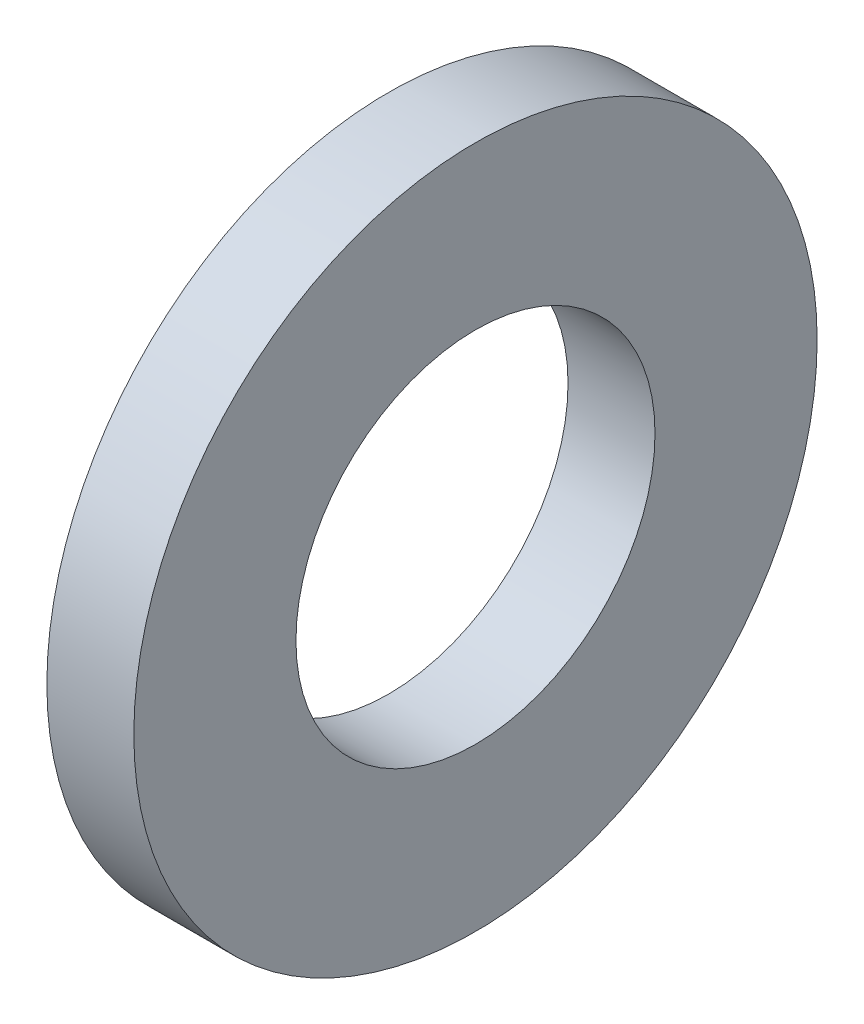
ISO-10303-21;
HEADER;
FILE_DESCRIPTION(('STEP AP214'),'2;1');
FILE_NAME('part.step','',(''),(''),'','','');
FILE_SCHEMA(('AUTOMOTIVE_DESIGN { 1 0 10303 214 1 1 1 1 }'));
ENDSEC;
DATA;
#1=APPLICATION_CONTEXT('core data for automotive mechanical design processes');
#2=APPLICATION_PROTOCOL_DEFINITION('international standard','automotive_design',2000,#1);
#3=PRODUCT_CONTEXT('',#1,'mechanical');
#4=PRODUCT('Part','Part','',(#3));
#5=PRODUCT_RELATED_PRODUCT_CATEGORY('part','',(#4));
#6=PRODUCT_DEFINITION_FORMATION('','',#4);
#7=PRODUCT_DEFINITION_CONTEXT('part definition',#1,'design');
#8=PRODUCT_DEFINITION('design','',#6,#7);
#9=PRODUCT_DEFINITION_SHAPE('','',#8);
#10=(LENGTH_UNIT() NAMED_UNIT(*) SI_UNIT(.MILLI.,.METRE.));
#11=(NAMED_UNIT(*) PLANE_ANGLE_UNIT() SI_UNIT($,.RADIAN.));
#12=(NAMED_UNIT(*) SI_UNIT($,.STERADIAN.) SOLID_ANGLE_UNIT());
#13=UNCERTAINTY_MEASURE_WITH_UNIT(LENGTH_MEASURE(1.E-05),#10,'distance_accuracy_value','');
#14=(GEOMETRIC_REPRESENTATION_CONTEXT(3) GLOBAL_UNCERTAINTY_ASSIGNED_CONTEXT((#13)) GLOBAL_UNIT_ASSIGNED_CONTEXT((#10,
#11,#12)) REPRESENTATION_CONTEXT('',''));
#15=CARTESIAN_POINT('',(0.,0.,0.));
#16=DIRECTION('',(0.,0.,1.));
#17=DIRECTION('',(1.,0.,0.));
#18=AXIS2_PLACEMENT_3D('',#15,#16,#17);
#19=CARTESIAN_POINT('',(-34.9249999999999,0.,0.));
#20=DIRECTION('',(-1.,0.,0.));
#21=DIRECTION('',(0.,0.,1.));
#22=AXIS2_PLACEMENT_3D('',#19,#20,#21);
#23=CYLINDRICAL_SURFACE('',#22,2.89);
#24=CARTESIAN_POINT('',(0.,0.,0.));
#25=DIRECTION('',(-1.,0.,0.));
#26=DIRECTION('',(0.,0.,1.));
#27=AXIS2_PLACEMENT_3D('',#24,#25,#26);
#28=CIRCLE('',#27,2.89);
#29=CARTESIAN_POINT('',(0.,0.,2.89));
#30=VERTEX_POINT('',#29);
#31=EDGE_CURVE('E10',#30,#30,#28,.T.);
#32=ORIENTED_EDGE('',*,*,#31,.F.);
#33=EDGE_LOOP('',(#32));
#34=FACE_BOUND('',#33,.T.);
#35=CARTESIAN_POINT('',(-1.4,0.,0.));
#36=DIRECTION('',(-1.,0.,0.));
#37=DIRECTION('',(0.,0.,1.));
#38=AXIS2_PLACEMENT_3D('',#35,#36,#37);
#39=CIRCLE('',#38,2.89);
#40=CARTESIAN_POINT('',(-1.4,0.,2.89));
#41=VERTEX_POINT('',#40);
#42=EDGE_CURVE('E45',#41,#41,#39,.T.);
#43=ORIENTED_EDGE('',*,*,#42,.T.);
#44=EDGE_LOOP('',(#43));
#45=FACE_BOUND('',#44,.T.);
#46=ADVANCED_FACE('F31',(#34,#45),#23,.F.);
#47=CARTESIAN_POINT('',(0.,2.89,0.));
#48=DIRECTION('',(-1.,0.,0.));
#49=DIRECTION('',(0.,0.,1.));
#50=AXIS2_PLACEMENT_3D('',#47,#48,#49);
#51=PLANE('',#50);
#52=CARTESIAN_POINT('',(0.,0.,0.));
#53=DIRECTION('',(-1.,0.,0.));
#54=DIRECTION('',(0.,0.,1.));
#55=AXIS2_PLACEMENT_3D('',#52,#53,#54);
#56=CIRCLE('',#55,5.5);
#57=CARTESIAN_POINT('',(0.,0.,5.5));
#58=VERTEX_POINT('',#57);
#59=EDGE_CURVE('E37',#58,#58,#56,.T.);
#60=ORIENTED_EDGE('',*,*,#59,.F.);
#61=EDGE_LOOP('',(#60));
#62=FACE_BOUND('',#61,.T.);
#63=ORIENTED_EDGE('',*,*,#31,.T.);
#64=EDGE_LOOP('',(#63));
#65=FACE_BOUND('',#64,.T.);
#66=ADVANCED_FACE('F60',(#62,#65),#51,.F.);
#67=CARTESIAN_POINT('',(-34.9249999999999,0.,0.));
#68=DIRECTION('',(-1.,0.,0.));
#69=DIRECTION('',(0.,0.,1.));
#70=AXIS2_PLACEMENT_3D('',#67,#68,#69);
#71=CYLINDRICAL_SURFACE('',#70,5.5);
#72=CARTESIAN_POINT('',(-1.4,0.,0.));
#73=DIRECTION('',(-1.,0.,0.));
#74=DIRECTION('',(0.,0.,1.));
#75=AXIS2_PLACEMENT_3D('',#72,#73,#74);
#76=CIRCLE('',#75,5.5);
#77=CARTESIAN_POINT('',(-1.4,0.,5.5));
#78=VERTEX_POINT('',#77);
#79=EDGE_CURVE('E41',#78,#78,#76,.T.);
#80=ORIENTED_EDGE('',*,*,#79,.F.);
#81=EDGE_LOOP('',(#80));
#82=FACE_BOUND('',#81,.T.);
#83=ORIENTED_EDGE('',*,*,#59,.T.);
#84=EDGE_LOOP('',(#83));
#85=FACE_BOUND('',#84,.T.);
#86=ADVANCED_FACE('F55',(#82,#85),#71,.T.);
#87=CARTESIAN_POINT('',(-1.4,5.5,0.));
#88=DIRECTION('',(1.,0.,0.));
#89=DIRECTION('',(0.,0.,-1.));
#90=AXIS2_PLACEMENT_3D('',#87,#88,#89);
#91=PLANE('',#90);
#92=ORIENTED_EDGE('',*,*,#42,.F.);
#93=EDGE_LOOP('',(#92));
#94=FACE_BOUND('',#93,.T.);
#95=ORIENTED_EDGE('',*,*,#79,.T.);
#96=EDGE_LOOP('',(#95));
#97=FACE_BOUND('',#96,.T.);
#98=ADVANCED_FACE('F52',(#94,#97),#91,.F.);
#99=CLOSED_SHELL('',(#46,#66,#86,#98));
#100=MANIFOLD_SOLID_BREP('B2',#99);
#101=ADVANCED_BREP_SHAPE_REPRESENTATION('',(#18,#100),#14);
#102=SHAPE_DEFINITION_REPRESENTATION(#9,#101);
ENDSEC;
END-ISO-10303-21;
